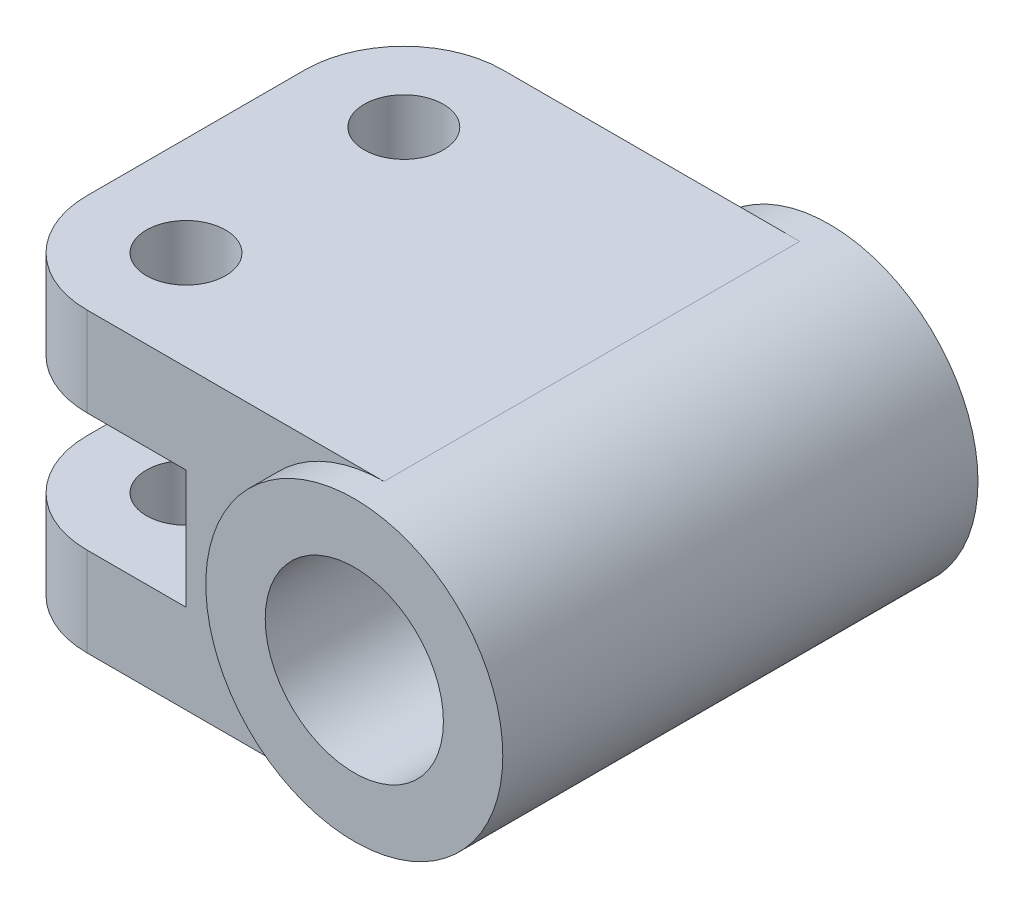
ISO-10303-21;
HEADER;
FILE_DESCRIPTION(('STEP AP214'),'2;1');
FILE_NAME('part.step','',(''),(''),'','','');
FILE_SCHEMA(('AUTOMOTIVE_DESIGN { 1 0 10303 214 1 1 1 1 }'));
ENDSEC;
DATA;
#1=APPLICATION_CONTEXT('core data for automotive mechanical design processes');
#2=APPLICATION_PROTOCOL_DEFINITION('international standard','automotive_design',2000,#1);
#3=PRODUCT_CONTEXT('',#1,'mechanical');
#4=PRODUCT('Part','Part','',(#3));
#5=PRODUCT_RELATED_PRODUCT_CATEGORY('part','',(#4));
#6=PRODUCT_DEFINITION_FORMATION('','',#4);
#7=PRODUCT_DEFINITION_CONTEXT('part definition',#1,'design');
#8=PRODUCT_DEFINITION('design','',#6,#7);
#9=PRODUCT_DEFINITION_SHAPE('','',#8);
#10=(LENGTH_UNIT() NAMED_UNIT(*) SI_UNIT(.MILLI.,.METRE.));
#11=(NAMED_UNIT(*) PLANE_ANGLE_UNIT() SI_UNIT($,.RADIAN.));
#12=(NAMED_UNIT(*) SI_UNIT($,.STERADIAN.) SOLID_ANGLE_UNIT());
#13=UNCERTAINTY_MEASURE_WITH_UNIT(LENGTH_MEASURE(1.E-05),#10,'distance_accuracy_value','');
#14=(GEOMETRIC_REPRESENTATION_CONTEXT(3) GLOBAL_UNCERTAINTY_ASSIGNED_CONTEXT((#13)) GLOBAL_UNIT_ASSIGNED_CONTEXT((#10,
#11,#12)) REPRESENTATION_CONTEXT('',''));
#15=CARTESIAN_POINT('',(0.,0.,0.));
#16=DIRECTION('',(0.,0.,1.));
#17=DIRECTION('',(1.,0.,0.));
#18=AXIS2_PLACEMENT_3D('',#15,#16,#17);
#19=CARTESIAN_POINT('',(40.,15.,42.));
#20=DIRECTION('',(0.,0.,-1.));
#21=DIRECTION('',(-1.,0.,0.));
#22=AXIS2_PLACEMENT_3D('',#19,#20,#21);
#23=CYLINDRICAL_SURFACE('',#22,15.);
#24=DIRECTION('',(0.,0.,-1.));
#25=VECTOR('',#24,1.);
#26=CARTESIAN_POINT('',(40.,0.,42.));
#27=LINE('',#26,#25);
#28=CARTESIAN_POINT('',(40.,0.,42.));
#29=VERTEX_POINT('',#28);
#30=CARTESIAN_POINT('',(40.,0.,0.));
#31=VERTEX_POINT('',#30);
#32=EDGE_CURVE('E137',#29,#31,#27,.T.);
#33=ORIENTED_EDGE('',*,*,#32,.T.);
#34=CARTESIAN_POINT('',(40.,15.,0.));
#35=DIRECTION('',(0.,0.,1.));
#36=DIRECTION('',(1.,0.,0.));
#37=AXIS2_PLACEMENT_3D('',#34,#35,#36);
#38=CIRCLE('',#37,15.);
#39=CARTESIAN_POINT('',(40.,30.,0.));
#40=VERTEX_POINT('',#39);
#41=EDGE_CURVE('E148',#40,#31,#38,.T.);
#42=ORIENTED_EDGE('',*,*,#41,.F.);
#43=DIRECTION('',(0.,0.,-1.));
#44=VECTOR('',#43,1.);
#45=CARTESIAN_POINT('',(40.,30.,42.));
#46=LINE('',#45,#44);
#47=CARTESIAN_POINT('',(40.,30.,42.));
#48=VERTEX_POINT('',#47);
#49=EDGE_CURVE('E157',#48,#40,#46,.T.);
#50=ORIENTED_EDGE('',*,*,#49,.F.);
#51=CARTESIAN_POINT('',(40.,15.,42.));
#52=DIRECTION('',(0.,0.,1.));
#53=DIRECTION('',(1.,0.,0.));
#54=AXIS2_PLACEMENT_3D('',#51,#52,#53);
#55=CIRCLE('',#54,15.);
#56=EDGE_CURVE('E161',#48,#29,#55,.T.);
#57=ORIENTED_EDGE('',*,*,#56,.T.);
#58=EDGE_LOOP('',(#33,#42,#50,#57));
#59=FACE_BOUND('',#58,.T.);
#60=CARTESIAN_POINT('',(40.,15.,-3.));
#61=DIRECTION('',(0.,0.,1.));
#62=DIRECTION('',(1.,0.,0.));
#63=AXIS2_PLACEMENT_3D('',#60,#61,#62);
#64=CIRCLE('',#63,15.);
#65=CARTESIAN_POINT('',(55.,15.,-3.));
#66=VERTEX_POINT('',#65);
#67=EDGE_CURVE('E307',#66,#66,#64,.T.);
#68=ORIENTED_EDGE('',*,*,#67,.T.);
#69=EDGE_LOOP('',(#68));
#70=FACE_BOUND('',#69,.T.);
#71=CARTESIAN_POINT('',(40.,15.,45.));
#72=DIRECTION('',(0.,0.,1.));
#73=DIRECTION('',(1.,0.,0.));
#74=AXIS2_PLACEMENT_3D('',#71,#72,#73);
#75=CIRCLE('',#74,15.);
#76=CARTESIAN_POINT('',(55.,15.,45.));
#77=VERTEX_POINT('',#76);
#78=EDGE_CURVE('E296',#77,#77,#75,.T.);
#79=ORIENTED_EDGE('',*,*,#78,.F.);
#80=EDGE_LOOP('',(#79));
#81=FACE_BOUND('',#80,.T.);
#82=ADVANCED_FACE('F43',(#59,#70,#81),#23,.T.);
#83=CARTESIAN_POINT('',(0.,30.,42.));
#84=DIRECTION('',(0.,1.,0.));
#85=DIRECTION('',(0.,0.,1.));
#86=AXIS2_PLACEMENT_3D('',#83,#84,#85);
#87=PLANE('',#86);
#88=CARTESIAN_POINT('',(10.,30.,32.));
#89=DIRECTION('',(0.,1.,0.));
#90=DIRECTION('',(0.,0.,1.));
#91=AXIS2_PLACEMENT_3D('',#88,#89,#90);
#92=CIRCLE('',#91,4.);
#93=CARTESIAN_POINT('',(10.,30.,36.));
#94=VERTEX_POINT('',#93);
#95=EDGE_CURVE('E321',#94,#94,#92,.T.);
#96=ORIENTED_EDGE('',*,*,#95,.F.);
#97=EDGE_LOOP('',(#96));
#98=FACE_BOUND('',#97,.T.);
#99=CARTESIAN_POINT('',(10.,30.,10.));
#100=DIRECTION('',(0.,1.,0.));
#101=DIRECTION('',(0.,0.,1.));
#102=AXIS2_PLACEMENT_3D('',#99,#100,#101);
#103=CIRCLE('',#102,4.);
#104=CARTESIAN_POINT('',(10.,30.,14.));
#105=VERTEX_POINT('',#104);
#106=EDGE_CURVE('E297',#105,#105,#103,.T.);
#107=ORIENTED_EDGE('',*,*,#106,.F.);
#108=EDGE_LOOP('',(#107));
#109=FACE_BOUND('',#108,.T.);
#110=DIRECTION('',(1.,0.,0.));
#111=VECTOR('',#110,1.);
#112=CARTESIAN_POINT('',(0.,30.,0.));
#113=LINE('',#112,#111);
#114=CARTESIAN_POINT('',(10.,30.,0.));
#115=VERTEX_POINT('',#114);
#116=EDGE_CURVE('E152',#115,#40,#113,.T.);
#117=ORIENTED_EDGE('',*,*,#116,.F.);
#118=CARTESIAN_POINT('',(10.,30.,10.));
#119=DIRECTION('',(0.,1.,0.));
#120=DIRECTION('',(0.,0.,1.));
#121=AXIS2_PLACEMENT_3D('',#118,#119,#120);
#122=CIRCLE('',#121,10.);
#123=CARTESIAN_POINT('',(0.,30.,10.));
#124=VERTEX_POINT('',#123);
#125=EDGE_CURVE('E199',#115,#124,#122,.T.);
#126=ORIENTED_EDGE('',*,*,#125,.T.);
#127=DIRECTION('',(0.,0.,-1.));
#128=VECTOR('',#127,1.);
#129=CARTESIAN_POINT('',(0.,30.,42.));
#130=LINE('',#129,#128);
#131=CARTESIAN_POINT('',(0.,30.,32.));
#132=VERTEX_POINT('',#131);
#133=EDGE_CURVE('E181',#132,#124,#130,.T.);
#134=ORIENTED_EDGE('',*,*,#133,.F.);
#135=CARTESIAN_POINT('',(10.,30.,32.));
#136=DIRECTION('',(0.,1.,0.));
#137=DIRECTION('',(0.,0.,1.));
#138=AXIS2_PLACEMENT_3D('',#135,#136,#137);
#139=CIRCLE('',#138,10.);
#140=CARTESIAN_POINT('',(10.,30.,42.));
#141=VERTEX_POINT('',#140);
#142=EDGE_CURVE('E197',#132,#141,#139,.T.);
#143=ORIENTED_EDGE('',*,*,#142,.T.);
#144=DIRECTION('',(1.,0.,0.));
#145=VECTOR('',#144,1.);
#146=CARTESIAN_POINT('',(0.,30.,42.));
#147=LINE('',#146,#145);
#148=EDGE_CURVE('E144',#141,#48,#147,.T.);
#149=ORIENTED_EDGE('',*,*,#148,.T.);
#150=ORIENTED_EDGE('',*,*,#49,.T.);
#151=EDGE_LOOP('',(#117,#126,#134,#143,#149,#150));
#152=FACE_BOUND('',#151,.T.);
#153=ADVANCED_FACE('F263',(#98,#109,#152),#87,.T.);
#154=CARTESIAN_POINT('',(0.,0.,42.));
#155=DIRECTION('',(1.,0.,0.));
#156=DIRECTION('',(0.,0.,-1.));
#157=AXIS2_PLACEMENT_3D('',#154,#155,#156);
#158=PLANE('',#157);
#159=ORIENTED_EDGE('',*,*,#133,.T.);
#160=DIRECTION('',(0.,-1.,0.));
#161=VECTOR('',#160,1.);
#162=CARTESIAN_POINT('',(0.,0.,10.));
#163=LINE('',#162,#161);
#164=CARTESIAN_POINT('',(0.,21.,10.));
#165=VERTEX_POINT('',#164);
#166=EDGE_CURVE('E186',#124,#165,#163,.T.);
#167=ORIENTED_EDGE('',*,*,#166,.T.);
#168=DIRECTION('',(0.,0.,-1.));
#169=VECTOR('',#168,1.);
#170=CARTESIAN_POINT('',(0.,21.,42.));
#171=LINE('',#170,#169);
#172=CARTESIAN_POINT('',(0.,21.,32.));
#173=VERTEX_POINT('',#172);
#174=EDGE_CURVE('E178',#173,#165,#171,.T.);
#175=ORIENTED_EDGE('',*,*,#174,.F.);
#176=DIRECTION('',(0.,-1.,0.));
#177=VECTOR('',#176,1.);
#178=CARTESIAN_POINT('',(0.,30.,32.));
#179=LINE('',#178,#177);
#180=EDGE_CURVE('E156',#173,#132,#179,.F.);
#181=ORIENTED_EDGE('',*,*,#180,.T.);
#182=EDGE_LOOP('',(#159,#167,#175,#181));
#183=FACE_BOUND('',#182,.T.);
#184=ADVANCED_FACE('F270',(#183),#158,.F.);
#185=CARTESIAN_POINT('',(0.,21.,42.));
#186=DIRECTION('',(0.,1.,0.));
#187=DIRECTION('',(0.,0.,1.));
#188=AXIS2_PLACEMENT_3D('',#185,#186,#187);
#189=PLANE('',#188);
#190=CARTESIAN_POINT('',(10.,21.,32.));
#191=DIRECTION('',(0.,1.,0.));
#192=DIRECTION('',(0.,0.,1.));
#193=AXIS2_PLACEMENT_3D('',#190,#191,#192);
#194=CIRCLE('',#193,4.);
#195=CARTESIAN_POINT('',(10.,21.,36.));
#196=VERTEX_POINT('',#195);
#197=EDGE_CURVE('E324',#196,#196,#194,.T.);
#198=ORIENTED_EDGE('',*,*,#197,.T.);
#199=EDGE_LOOP('',(#198));
#200=FACE_BOUND('',#199,.T.);
#201=CARTESIAN_POINT('',(10.,21.,10.));
#202=DIRECTION('',(0.,1.,0.));
#203=DIRECTION('',(0.,0.,1.));
#204=AXIS2_PLACEMENT_3D('',#201,#202,#203);
#205=CIRCLE('',#204,4.);
#206=CARTESIAN_POINT('',(10.,21.,14.));
#207=VERTEX_POINT('',#206);
#208=EDGE_CURVE('E302',#207,#207,#205,.T.);
#209=ORIENTED_EDGE('',*,*,#208,.T.);
#210=EDGE_LOOP('',(#209));
#211=FACE_BOUND('',#210,.T.);
#212=ORIENTED_EDGE('',*,*,#174,.T.);
#213=CARTESIAN_POINT('',(10.,21.,10.));
#214=DIRECTION('',(0.,1.,0.));
#215=DIRECTION('',(0.,0.,1.));
#216=AXIS2_PLACEMENT_3D('',#213,#214,#215);
#217=CIRCLE('',#216,10.);
#218=CARTESIAN_POINT('',(10.,21.,0.));
#219=VERTEX_POINT('',#218);
#220=EDGE_CURVE('E191',#165,#219,#217,.F.);
#221=ORIENTED_EDGE('',*,*,#220,.T.);
#222=DIRECTION('',(1.,0.,0.));
#223=VECTOR('',#222,1.);
#224=CARTESIAN_POINT('',(0.,21.,0.));
#225=LINE('',#224,#223);
#226=CARTESIAN_POINT('',(20.,21.,0.));
#227=VERTEX_POINT('',#226);
#228=EDGE_CURVE('E233',#219,#227,#225,.T.);
#229=ORIENTED_EDGE('',*,*,#228,.T.);
#230=DIRECTION('',(0.,0.,-1.));
#231=VECTOR('',#230,1.);
#232=CARTESIAN_POINT('',(20.,21.,42.));
#233=LINE('',#232,#231);
#234=CARTESIAN_POINT('',(20.,21.,42.));
#235=VERTEX_POINT('',#234);
#236=EDGE_CURVE('E175',#235,#227,#233,.T.);
#237=ORIENTED_EDGE('',*,*,#236,.F.);
#238=DIRECTION('',(1.,0.,0.));
#239=VECTOR('',#238,1.);
#240=CARTESIAN_POINT('',(0.,21.,42.));
#241=LINE('',#240,#239);
#242=CARTESIAN_POINT('',(10.,21.,42.));
#243=VERTEX_POINT('',#242);
#244=EDGE_CURVE('E217',#243,#235,#241,.T.);
#245=ORIENTED_EDGE('',*,*,#244,.F.);
#246=CARTESIAN_POINT('',(10.,21.,32.));
#247=DIRECTION('',(0.,1.,0.));
#248=DIRECTION('',(0.,0.,1.));
#249=AXIS2_PLACEMENT_3D('',#246,#247,#248);
#250=CIRCLE('',#249,10.);
#251=EDGE_CURVE('E189',#243,#173,#250,.F.);
#252=ORIENTED_EDGE('',*,*,#251,.T.);
#253=EDGE_LOOP('',(#212,#221,#229,#237,#245,#252));
#254=FACE_BOUND('',#253,.T.);
#255=ADVANCED_FACE('F222',(#200,#211,#254),#189,.F.);
#256=CARTESIAN_POINT('',(20.,0.,42.));
#257=DIRECTION('',(-1.,0.,0.));
#258=DIRECTION('',(0.,0.,1.));
#259=AXIS2_PLACEMENT_3D('',#256,#257,#258);
#260=PLANE('',#259);
#261=DIRECTION('',(0.,1.,0.));
#262=VECTOR('',#261,1.);
#263=CARTESIAN_POINT('',(20.,0.,0.));
#264=LINE('',#263,#262);
#265=CARTESIAN_POINT('',(20.,9.,0.));
#266=VERTEX_POINT('',#265);
#267=EDGE_CURVE('E235',#266,#227,#264,.T.);
#268=ORIENTED_EDGE('',*,*,#267,.F.);
#269=DIRECTION('',(0.,0.,-1.));
#270=VECTOR('',#269,1.);
#271=CARTESIAN_POINT('',(20.,9.,42.));
#272=LINE('',#271,#270);
#273=CARTESIAN_POINT('',(20.,9.,42.));
#274=VERTEX_POINT('',#273);
#275=EDGE_CURVE('E172',#274,#266,#272,.T.);
#276=ORIENTED_EDGE('',*,*,#275,.F.);
#277=DIRECTION('',(0.,1.,0.));
#278=VECTOR('',#277,1.);
#279=CARTESIAN_POINT('',(20.,0.,42.));
#280=LINE('',#279,#278);
#281=EDGE_CURVE('E225',#274,#235,#280,.T.);
#282=ORIENTED_EDGE('',*,*,#281,.T.);
#283=ORIENTED_EDGE('',*,*,#236,.T.);
#284=EDGE_LOOP('',(#268,#276,#282,#283));
#285=FACE_BOUND('',#284,.T.);
#286=ADVANCED_FACE('F243',(#285),#260,.T.);
#287=CARTESIAN_POINT('',(0.,9.,42.));
#288=DIRECTION('',(0.,1.,0.));
#289=DIRECTION('',(0.,0.,1.));
#290=AXIS2_PLACEMENT_3D('',#287,#288,#289);
#291=PLANE('',#290);
#292=CARTESIAN_POINT('',(10.,9.,32.));
#293=DIRECTION('',(0.,1.,0.));
#294=DIRECTION('',(0.,0.,1.));
#295=AXIS2_PLACEMENT_3D('',#292,#293,#294);
#296=CIRCLE('',#295,4.);
#297=CARTESIAN_POINT('',(10.,9.,36.));
#298=VERTEX_POINT('',#297);
#299=EDGE_CURVE('E327',#298,#298,#296,.T.);
#300=ORIENTED_EDGE('',*,*,#299,.F.);
#301=EDGE_LOOP('',(#300));
#302=FACE_BOUND('',#301,.T.);
#303=CARTESIAN_POINT('',(10.,9.,10.));
#304=DIRECTION('',(0.,1.,0.));
#305=DIRECTION('',(0.,0.,1.));
#306=AXIS2_PLACEMENT_3D('',#303,#304,#305);
#307=CIRCLE('',#306,4.);
#308=CARTESIAN_POINT('',(10.,9.,14.));
#309=VERTEX_POINT('',#308);
#310=EDGE_CURVE('E315',#309,#309,#307,.T.);
#311=ORIENTED_EDGE('',*,*,#310,.F.);
#312=EDGE_LOOP('',(#311));
#313=FACE_BOUND('',#312,.T.);
#314=DIRECTION('',(1.,0.,0.));
#315=VECTOR('',#314,1.);
#316=CARTESIAN_POINT('',(0.,9.,0.));
#317=LINE('',#316,#315);
#318=CARTESIAN_POINT('',(10.,9.,0.));
#319=VERTEX_POINT('',#318);
#320=EDGE_CURVE('E145',#319,#266,#317,.T.);
#321=ORIENTED_EDGE('',*,*,#320,.F.);
#322=CARTESIAN_POINT('',(10.,9.,10.));
#323=DIRECTION('',(0.,1.,0.));
#324=DIRECTION('',(0.,0.,1.));
#325=AXIS2_PLACEMENT_3D('',#322,#323,#324);
#326=CIRCLE('',#325,10.);
#327=CARTESIAN_POINT('',(0.,9.,10.));
#328=VERTEX_POINT('',#327);
#329=EDGE_CURVE('E203',#319,#328,#326,.T.);
#330=ORIENTED_EDGE('',*,*,#329,.T.);
#331=DIRECTION('',(0.,0.,-1.));
#332=VECTOR('',#331,1.);
#333=CARTESIAN_POINT('',(0.,9.,42.));
#334=LINE('',#333,#332);
#335=CARTESIAN_POINT('',(0.,9.,32.));
#336=VERTEX_POINT('',#335);
#337=EDGE_CURVE('E165',#336,#328,#334,.T.);
#338=ORIENTED_EDGE('',*,*,#337,.F.);
#339=CARTESIAN_POINT('',(10.,9.,32.));
#340=DIRECTION('',(0.,1.,0.));
#341=DIRECTION('',(0.,0.,1.));
#342=AXIS2_PLACEMENT_3D('',#339,#340,#341);
#343=CIRCLE('',#342,10.);
#344=CARTESIAN_POINT('',(10.,9.,42.));
#345=VERTEX_POINT('',#344);
#346=EDGE_CURVE('E201',#336,#345,#343,.T.);
#347=ORIENTED_EDGE('',*,*,#346,.T.);
#348=DIRECTION('',(1.,0.,0.));
#349=VECTOR('',#348,1.);
#350=CARTESIAN_POINT('',(0.,9.,42.));
#351=LINE('',#350,#349);
#352=EDGE_CURVE('E167',#345,#274,#351,.T.);
#353=ORIENTED_EDGE('',*,*,#352,.T.);
#354=ORIENTED_EDGE('',*,*,#275,.T.);
#355=EDGE_LOOP('',(#321,#330,#338,#347,#353,#354));
#356=FACE_BOUND('',#355,.T.);
#357=ADVANCED_FACE('F241',(#302,#313,#356),#291,.T.);
#358=CARTESIAN_POINT('',(0.,0.,42.));
#359=DIRECTION('',(-1.,0.,0.));
#360=DIRECTION('',(0.,0.,1.));
#361=AXIS2_PLACEMENT_3D('',#358,#359,#360);
#362=PLANE('',#361);
#363=ORIENTED_EDGE('',*,*,#337,.T.);
#364=DIRECTION('',(0.,1.,0.));
#365=VECTOR('',#364,1.);
#366=CARTESIAN_POINT('',(0.,0.,10.));
#367=LINE('',#366,#365);
#368=CARTESIAN_POINT('',(0.,0.,10.));
#369=VERTEX_POINT('',#368);
#370=EDGE_CURVE('E64',#328,#369,#367,.F.);
#371=ORIENTED_EDGE('',*,*,#370,.T.);
#372=DIRECTION('',(0.,0.,-1.));
#373=VECTOR('',#372,1.);
#374=CARTESIAN_POINT('',(0.,0.,42.));
#375=LINE('',#374,#373);
#376=CARTESIAN_POINT('',(0.,0.,32.));
#377=VERTEX_POINT('',#376);
#378=EDGE_CURVE('E162',#377,#369,#375,.T.);
#379=ORIENTED_EDGE('',*,*,#378,.F.);
#380=DIRECTION('',(0.,1.,0.));
#381=VECTOR('',#380,1.);
#382=CARTESIAN_POINT('',(0.,0.,32.));
#383=LINE('',#382,#381);
#384=EDGE_CURVE('E205',#377,#336,#383,.T.);
#385=ORIENTED_EDGE('',*,*,#384,.T.);
#386=EDGE_LOOP('',(#363,#371,#379,#385));
#387=FACE_BOUND('',#386,.T.);
#388=ADVANCED_FACE('F248',(#387),#362,.T.);
#389=CARTESIAN_POINT('',(0.,0.,42.));
#390=DIRECTION('',(0.,1.,0.));
#391=DIRECTION('',(0.,0.,1.));
#392=AXIS2_PLACEMENT_3D('',#389,#390,#391);
#393=PLANE('',#392);
#394=CARTESIAN_POINT('',(10.,0.,32.));
#395=DIRECTION('',(0.,1.,0.));
#396=DIRECTION('',(0.,0.,1.));
#397=AXIS2_PLACEMENT_3D('',#394,#395,#396);
#398=CIRCLE('',#397,4.);
#399=CARTESIAN_POINT('',(10.,0.,36.));
#400=VERTEX_POINT('',#399);
#401=EDGE_CURVE('E330',#400,#400,#398,.T.);
#402=ORIENTED_EDGE('',*,*,#401,.T.);
#403=EDGE_LOOP('',(#402));
#404=FACE_BOUND('',#403,.T.);
#405=CARTESIAN_POINT('',(10.,0.,10.));
#406=DIRECTION('',(0.,1.,0.));
#407=DIRECTION('',(0.,0.,1.));
#408=AXIS2_PLACEMENT_3D('',#405,#406,#407);
#409=CIRCLE('',#408,4.);
#410=CARTESIAN_POINT('',(10.,0.,14.));
#411=VERTEX_POINT('',#410);
#412=EDGE_CURVE('E318',#411,#411,#409,.T.);
#413=ORIENTED_EDGE('',*,*,#412,.T.);
#414=EDGE_LOOP('',(#413));
#415=FACE_BOUND('',#414,.T.);
#416=ORIENTED_EDGE('',*,*,#378,.T.);
#417=CARTESIAN_POINT('',(10.,0.,10.));
#418=DIRECTION('',(0.,1.,0.));
#419=DIRECTION('',(0.,0.,1.));
#420=AXIS2_PLACEMENT_3D('',#417,#418,#419);
#421=CIRCLE('',#420,10.);
#422=CARTESIAN_POINT('',(10.,0.,0.));
#423=VERTEX_POINT('',#422);
#424=EDGE_CURVE('E140',#369,#423,#421,.F.);
#425=ORIENTED_EDGE('',*,*,#424,.T.);
#426=DIRECTION('',(1.,0.,0.));
#427=VECTOR('',#426,1.);
#428=CARTESIAN_POINT('',(0.,0.,0.));
#429=LINE('',#428,#427);
#430=EDGE_CURVE('E133',#423,#31,#429,.T.);
#431=ORIENTED_EDGE('',*,*,#430,.T.);
#432=ORIENTED_EDGE('',*,*,#32,.F.);
#433=DIRECTION('',(1.,0.,0.));
#434=VECTOR('',#433,1.);
#435=CARTESIAN_POINT('',(0.,0.,42.));
#436=LINE('',#435,#434);
#437=CARTESIAN_POINT('',(10.,0.,42.));
#438=VERTEX_POINT('',#437);
#439=EDGE_CURVE('E163',#438,#29,#436,.T.);
#440=ORIENTED_EDGE('',*,*,#439,.F.);
#441=CARTESIAN_POINT('',(10.,0.,32.));
#442=DIRECTION('',(0.,1.,0.));
#443=DIRECTION('',(0.,0.,1.));
#444=AXIS2_PLACEMENT_3D('',#441,#442,#443);
#445=CIRCLE('',#444,10.);
#446=EDGE_CURVE('E209',#438,#377,#445,.F.);
#447=ORIENTED_EDGE('',*,*,#446,.T.);
#448=EDGE_LOOP('',(#416,#425,#431,#432,#440,#447));
#449=FACE_BOUND('',#448,.T.);
#450=ADVANCED_FACE('F135',(#404,#415,#449),#393,.F.);
#451=CARTESIAN_POINT('',(0.,0.,42.));
#452=DIRECTION('',(0.,0.,1.));
#453=DIRECTION('',(1.,0.,0.));
#454=AXIS2_PLACEMENT_3D('',#451,#452,#453);
#455=PLANE('',#454);
#456=ORIENTED_EDGE('',*,*,#352,.F.);
#457=DIRECTION('',(0.,1.,0.));
#458=VECTOR('',#457,1.);
#459=CARTESIAN_POINT('',(10.,0.,42.));
#460=LINE('',#459,#458);
#461=EDGE_CURVE('E11',#345,#438,#460,.F.);
#462=ORIENTED_EDGE('',*,*,#461,.T.);
#463=ORIENTED_EDGE('',*,*,#439,.T.);
#464=ORIENTED_EDGE('',*,*,#56,.F.);
#465=ORIENTED_EDGE('',*,*,#148,.F.);
#466=DIRECTION('',(0.,-1.,0.));
#467=VECTOR('',#466,1.);
#468=CARTESIAN_POINT('',(10.,21.,42.));
#469=LINE('',#468,#467);
#470=EDGE_CURVE('E51',#141,#243,#469,.T.);
#471=ORIENTED_EDGE('',*,*,#470,.T.);
#472=ORIENTED_EDGE('',*,*,#244,.T.);
#473=ORIENTED_EDGE('',*,*,#281,.F.);
#474=EDGE_LOOP('',(#456,#462,#463,#464,#465,#471,#472,#473));
#475=FACE_BOUND('',#474,.T.);
#476=ADVANCED_FACE('F215',(#475),#455,.T.);
#477=CARTESIAN_POINT('',(0.,0.,0.));
#478=DIRECTION('',(0.,0.,1.));
#479=DIRECTION('',(1.,0.,0.));
#480=AXIS2_PLACEMENT_3D('',#477,#478,#479);
#481=PLANE('',#480);
#482=ORIENTED_EDGE('',*,*,#228,.F.);
#483=DIRECTION('',(0.,-1.,0.));
#484=VECTOR('',#483,1.);
#485=CARTESIAN_POINT('',(10.,0.,0.));
#486=LINE('',#485,#484);
#487=EDGE_CURVE('E195',#219,#115,#486,.F.);
#488=ORIENTED_EDGE('',*,*,#487,.T.);
#489=ORIENTED_EDGE('',*,*,#116,.T.);
#490=ORIENTED_EDGE('',*,*,#41,.T.);
#491=ORIENTED_EDGE('',*,*,#430,.F.);
#492=DIRECTION('',(0.,1.,0.));
#493=VECTOR('',#492,1.);
#494=CARTESIAN_POINT('',(10.,9.,0.));
#495=LINE('',#494,#493);
#496=EDGE_CURVE('E193',#423,#319,#495,.T.);
#497=ORIENTED_EDGE('',*,*,#496,.T.);
#498=ORIENTED_EDGE('',*,*,#320,.T.);
#499=ORIENTED_EDGE('',*,*,#267,.T.);
#500=EDGE_LOOP('',(#482,#488,#489,#490,#491,#497,#498,#499));
#501=FACE_BOUND('',#500,.T.);
#502=ADVANCED_FACE('F150',(#501),#481,.F.);
#503=CARTESIAN_POINT('',(40.,15.,-3.));
#504=DIRECTION('',(0.,0.,1.));
#505=DIRECTION('',(1.,0.,0.));
#506=AXIS2_PLACEMENT_3D('',#503,#504,#505);
#507=PLANE('',#506);
#508=CARTESIAN_POINT('',(40.,15.,-3.));
#509=DIRECTION('',(0.,0.,1.));
#510=DIRECTION('',(1.,0.,0.));
#511=AXIS2_PLACEMENT_3D('',#508,#509,#510);
#512=CIRCLE('',#511,9.);
#513=CARTESIAN_POINT('',(31.,15.,-3.));
#514=VERTEX_POINT('',#513);
#515=EDGE_CURVE('E291',#514,#514,#512,.T.);
#516=ORIENTED_EDGE('',*,*,#515,.T.);
#517=EDGE_LOOP('',(#516));
#518=FACE_BOUND('',#517,.T.);
#519=ORIENTED_EDGE('',*,*,#67,.F.);
#520=EDGE_LOOP('',(#519));
#521=FACE_BOUND('',#520,.T.);
#522=ADVANCED_FACE('F278',(#518,#521),#507,.F.);
#523=CARTESIAN_POINT('',(40.,15.,42.));
#524=DIRECTION('',(0.,0.,-1.));
#525=DIRECTION('',(-1.,0.,0.));
#526=AXIS2_PLACEMENT_3D('',#523,#524,#525);
#527=CYLINDRICAL_SURFACE('',#526,9.);
#528=CARTESIAN_POINT('',(40.,15.,45.));
#529=DIRECTION('',(0.,0.,1.));
#530=DIRECTION('',(1.,0.,0.));
#531=AXIS2_PLACEMENT_3D('',#528,#529,#530);
#532=CIRCLE('',#531,9.);
#533=CARTESIAN_POINT('',(31.,15.,45.));
#534=VERTEX_POINT('',#533);
#535=EDGE_CURVE('E294',#534,#534,#532,.T.);
#536=CARTESIAN_POINT('',(31.,15.,-3.));
#537=CARTESIAN_POINT('',(31.,15.,-2.5));
#538=CARTESIAN_POINT('',(31.,15.,-2.));
#539=CARTESIAN_POINT('',(31.,15.,-1.));
#540=CARTESIAN_POINT('',(31.,15.,-0.5));
#541=CARTESIAN_POINT('',(31.,15.,0.5));
#542=CARTESIAN_POINT('',(31.,15.,1.));
#543=CARTESIAN_POINT('',(31.,15.,2.));
#544=CARTESIAN_POINT('',(31.,15.,2.5));
#545=CARTESIAN_POINT('',(31.,15.,3.5));
#546=CARTESIAN_POINT('',(31.,15.,4.));
#547=CARTESIAN_POINT('',(31.,15.,5.));
#548=CARTESIAN_POINT('',(31.,15.,5.5));
#549=CARTESIAN_POINT('',(31.,15.,6.5));
#550=CARTESIAN_POINT('',(31.,15.,7.));
#551=CARTESIAN_POINT('',(31.,15.,8.));
#552=CARTESIAN_POINT('',(31.,15.,8.5));
#553=CARTESIAN_POINT('',(31.,15.,9.5));
#554=CARTESIAN_POINT('',(31.,15.,10.));
#555=CARTESIAN_POINT('',(31.,15.,11.));
#556=CARTESIAN_POINT('',(31.,15.,11.5));
#557=CARTESIAN_POINT('',(31.,15.,12.5));
#558=CARTESIAN_POINT('',(31.,15.,13.));
#559=CARTESIAN_POINT('',(31.,15.,14.));
#560=CARTESIAN_POINT('',(31.,15.,14.5));
#561=CARTESIAN_POINT('',(31.,15.,15.5));
#562=CARTESIAN_POINT('',(31.,15.,16.));
#563=CARTESIAN_POINT('',(31.,15.,17.));
#564=CARTESIAN_POINT('',(31.,15.,17.5));
#565=CARTESIAN_POINT('',(31.,15.,18.5));
#566=CARTESIAN_POINT('',(31.,15.,19.));
#567=CARTESIAN_POINT('',(31.,15.,20.));
#568=CARTESIAN_POINT('',(31.,15.,20.5));
#569=CARTESIAN_POINT('',(31.,15.,21.5));
#570=CARTESIAN_POINT('',(31.,15.,22.));
#571=CARTESIAN_POINT('',(31.,15.,23.));
#572=CARTESIAN_POINT('',(31.,15.,23.5));
#573=CARTESIAN_POINT('',(31.,15.,24.5));
#574=CARTESIAN_POINT('',(31.,15.,25.));
#575=CARTESIAN_POINT('',(31.,15.,26.));
#576=CARTESIAN_POINT('',(31.,15.,26.5));
#577=CARTESIAN_POINT('',(31.,15.,27.5));
#578=CARTESIAN_POINT('',(31.,15.,28.));
#579=CARTESIAN_POINT('',(31.,15.,29.));
#580=CARTESIAN_POINT('',(31.,15.,29.5));
#581=CARTESIAN_POINT('',(31.,15.,30.5));
#582=CARTESIAN_POINT('',(31.,15.,31.));
#583=CARTESIAN_POINT('',(31.,15.,32.));
#584=CARTESIAN_POINT('',(31.,15.,32.5));
#585=CARTESIAN_POINT('',(31.,15.,33.5));
#586=CARTESIAN_POINT('',(31.,15.,34.));
#587=CARTESIAN_POINT('',(31.,15.,35.));
#588=CARTESIAN_POINT('',(31.,15.,35.5));
#589=CARTESIAN_POINT('',(31.,15.,36.5));
#590=CARTESIAN_POINT('',(31.,15.,37.));
#591=CARTESIAN_POINT('',(31.,15.,38.));
#592=CARTESIAN_POINT('',(31.,15.,38.5));
#593=CARTESIAN_POINT('',(31.,15.,39.5));
#594=CARTESIAN_POINT('',(31.,15.,40.));
#595=CARTESIAN_POINT('',(31.,15.,41.));
#596=CARTESIAN_POINT('',(31.,15.,41.5));
#597=CARTESIAN_POINT('',(31.,15.,42.5));
#598=CARTESIAN_POINT('',(31.,15.,43.));
#599=CARTESIAN_POINT('',(31.,15.,44.));
#600=CARTESIAN_POINT('',(31.,15.,44.5));
#601=CARTESIAN_POINT('',(31.,15.,45.));
#602=B_SPLINE_CURVE_WITH_KNOTS('',3,(#536,#537,#538,#539,#540,#541,#542,#543,#544,#545,#546,
#547,#548,#549,#550,#551,#552,#553,#554,#555,#556,#557,#558,#559,#560,#561,#562,#563,#564,#565,
#566,#567,#568,#569,#570,#571,#572,#573,#574,#575,#576,#577,#578,#579,#580,#581,#582,#583,#584,
#585,#586,#587,#588,#589,#590,#591,#592,#593,#594,#595,#596,#597,#598,#599,#600,#601),
.UNSPECIFIED.,.F.,.F.,(4,2,2,2,2,2,2,2,2,2,2,2,2,2,2,2,2,2,2,2,2,2,2,2,2,2,2,2,2,2,2,2,4),(0.,
1.5,3.,4.5,6.00000000000001,7.5,9.,10.5,12.,13.5,15.,16.5,18.,19.5,21.,22.5,24.,25.5,27.,28.5,
30.,31.5,33.,34.5,36.,37.5,39.,40.5,42.,43.5,45.,46.5,48.),.UNSPECIFIED.);
#603=EDGE_CURVE('BSEAM275',#514,#534,#602,.T.);
#604=ORIENTED_EDGE('',*,*,#515,.F.);
#605=ORIENTED_EDGE('',*,*,#535,.T.);
#606=ORIENTED_EDGE('',*,*,#603,.T.);
#607=ORIENTED_EDGE('',*,*,#603,.F.);
#608=EDGE_LOOP('',(#604,#606,#605,#607));
#609=FACE_BOUND('',#608,.T.);
#610=ADVANCED_FACE('F275',(#609),#527,.F.);
#611=CARTESIAN_POINT('',(40.,15.,45.));
#612=DIRECTION('',(0.,0.,1.));
#613=DIRECTION('',(1.,0.,0.));
#614=AXIS2_PLACEMENT_3D('',#611,#612,#613);
#615=PLANE('',#614);
#616=ORIENTED_EDGE('',*,*,#78,.T.);
#617=EDGE_LOOP('',(#616));
#618=FACE_BOUND('',#617,.T.);
#619=ORIENTED_EDGE('',*,*,#535,.F.);
#620=EDGE_LOOP('',(#619));
#621=FACE_BOUND('',#620,.T.);
#622=ADVANCED_FACE('F277',(#618,#621),#615,.T.);
#623=CARTESIAN_POINT('',(10.,0.,10.));
#624=DIRECTION('',(0.,1.,0.));
#625=DIRECTION('',(0.,0.,1.));
#626=AXIS2_PLACEMENT_3D('',#623,#624,#625);
#627=CYLINDRICAL_SURFACE('',#626,4.);
#628=ORIENTED_EDGE('',*,*,#310,.T.);
#629=EDGE_LOOP('',(#628));
#630=FACE_BOUND('',#629,.T.);
#631=ORIENTED_EDGE('',*,*,#412,.F.);
#632=EDGE_LOOP('',(#631));
#633=FACE_BOUND('',#632,.T.);
#634=ADVANCED_FACE('F283',(#630,#633),#627,.F.);
#635=CARTESIAN_POINT('',(10.,30.,14.));
#636=CARTESIAN_POINT('',(10.,29.90625,14.));
#637=CARTESIAN_POINT('',(10.,29.8125,14.));
#638=CARTESIAN_POINT('',(10.,29.625,14.));
#639=CARTESIAN_POINT('',(10.,29.53125,14.));
#640=CARTESIAN_POINT('',(10.,29.34375,14.));
#641=CARTESIAN_POINT('',(10.,29.25,14.));
#642=CARTESIAN_POINT('',(10.,29.0625,14.));
#643=CARTESIAN_POINT('',(10.,28.96875,14.));
#644=CARTESIAN_POINT('',(10.,28.78125,14.));
#645=CARTESIAN_POINT('',(10.,28.6875,14.));
#646=CARTESIAN_POINT('',(10.,28.5,14.));
#647=CARTESIAN_POINT('',(10.,28.40625,14.));
#648=CARTESIAN_POINT('',(10.,28.21875,14.));
#649=CARTESIAN_POINT('',(10.,28.125,14.));
#650=CARTESIAN_POINT('',(10.,27.9375,14.));
#651=CARTESIAN_POINT('',(10.,27.84375,14.));
#652=CARTESIAN_POINT('',(10.,27.65625,14.));
#653=CARTESIAN_POINT('',(10.,27.5625,14.));
#654=CARTESIAN_POINT('',(10.,27.375,14.));
#655=CARTESIAN_POINT('',(10.,27.28125,14.));
#656=CARTESIAN_POINT('',(10.,27.09375,14.));
#657=CARTESIAN_POINT('',(10.,27.,14.));
#658=CARTESIAN_POINT('',(10.,26.8125,14.));
#659=CARTESIAN_POINT('',(10.,26.71875,14.));
#660=CARTESIAN_POINT('',(10.,26.53125,14.));
#661=CARTESIAN_POINT('',(10.,26.4375,14.));
#662=CARTESIAN_POINT('',(10.,26.25,14.));
#663=CARTESIAN_POINT('',(10.,26.15625,14.));
#664=CARTESIAN_POINT('',(10.,25.96875,14.));
#665=CARTESIAN_POINT('',(10.,25.875,14.));
#666=CARTESIAN_POINT('',(10.,25.6875,14.));
#667=CARTESIAN_POINT('',(10.,25.59375,14.));
#668=CARTESIAN_POINT('',(10.,25.40625,14.));
#669=CARTESIAN_POINT('',(10.,25.3125,14.));
#670=CARTESIAN_POINT('',(10.,25.125,14.));
#671=CARTESIAN_POINT('',(10.,25.03125,14.));
#672=CARTESIAN_POINT('',(10.,24.84375,14.));
#673=CARTESIAN_POINT('',(10.,24.75,14.));
#674=CARTESIAN_POINT('',(10.,24.5625,14.));
#675=CARTESIAN_POINT('',(10.,24.46875,14.));
#676=CARTESIAN_POINT('',(10.,24.28125,14.));
#677=CARTESIAN_POINT('',(10.,24.1875,14.));
#678=CARTESIAN_POINT('',(10.,24.,14.));
#679=CARTESIAN_POINT('',(10.,23.90625,14.));
#680=CARTESIAN_POINT('',(10.,23.71875,14.));
#681=CARTESIAN_POINT('',(10.,23.625,14.));
#682=CARTESIAN_POINT('',(10.,23.4375,14.));
#683=CARTESIAN_POINT('',(10.,23.34375,14.));
#684=CARTESIAN_POINT('',(10.,23.15625,14.));
#685=CARTESIAN_POINT('',(10.,23.0625,14.));
#686=CARTESIAN_POINT('',(10.,22.875,14.));
#687=CARTESIAN_POINT('',(10.,22.78125,14.));
#688=CARTESIAN_POINT('',(10.,22.59375,14.));
#689=CARTESIAN_POINT('',(10.,22.5,14.));
#690=CARTESIAN_POINT('',(10.,22.3125,14.));
#691=CARTESIAN_POINT('',(10.,22.21875,14.));
#692=CARTESIAN_POINT('',(10.,22.03125,14.));
#693=CARTESIAN_POINT('',(10.,21.9375,14.));
#694=CARTESIAN_POINT('',(10.,21.75,14.));
#695=CARTESIAN_POINT('',(10.,21.65625,14.));
#696=CARTESIAN_POINT('',(10.,21.46875,14.));
#697=CARTESIAN_POINT('',(10.,21.375,14.));
#698=CARTESIAN_POINT('',(10.,21.1875,14.));
#699=CARTESIAN_POINT('',(10.,21.09375,14.));
#700=CARTESIAN_POINT('',(10.,21.,14.));
#701=B_SPLINE_CURVE_WITH_KNOTS('',3,(#635,#636,#637,#638,#639,#640,#641,#642,#643,#644,#645,
#646,#647,#648,#649,#650,#651,#652,#653,#654,#655,#656,#657,#658,#659,#660,#661,#662,#663,#664,
#665,#666,#667,#668,#669,#670,#671,#672,#673,#674,#675,#676,#677,#678,#679,#680,#681,#682,#683,
#684,#685,#686,#687,#688,#689,#690,#691,#692,#693,#694,#695,#696,#697,#698,#699,#700),
.UNSPECIFIED.,.F.,.F.,(4,2,2,2,2,2,2,2,2,2,2,2,2,2,2,2,2,2,2,2,2,2,2,2,2,2,2,2,2,2,2,2,4),(0.,
0.28125,0.5625,0.843750000000001,1.125,1.40625,1.6875,1.96875,2.25,2.53125,2.8125,3.09375,3.375,
3.65625,3.9375,4.21875,4.5,4.78125,5.0625,5.34375,5.625,5.90625,6.1875,6.46875,6.75,7.03125,
7.3125,7.59375,7.875,8.15625,8.4375,8.71875,9.),.UNSPECIFIED.);
#702=EDGE_CURVE('BSEAM338',#105,#207,#701,.T.);
#703=ORIENTED_EDGE('',*,*,#106,.T.);
#704=ORIENTED_EDGE('',*,*,#208,.F.);
#705=ORIENTED_EDGE('',*,*,#702,.T.);
#706=ORIENTED_EDGE('',*,*,#702,.F.);
#707=EDGE_LOOP('',(#703,#705,#704,#706));
#708=FACE_BOUND('',#707,.T.);
#709=ADVANCED_FACE('F338',(#708),#627,.F.);
#710=CARTESIAN_POINT('',(10.,0.,32.));
#711=DIRECTION('',(0.,1.,0.));
#712=DIRECTION('',(0.,0.,1.));
#713=AXIS2_PLACEMENT_3D('',#710,#711,#712);
#714=CYLINDRICAL_SURFACE('',#713,4.);
#715=ORIENTED_EDGE('',*,*,#299,.T.);
#716=EDGE_LOOP('',(#715));
#717=FACE_BOUND('',#716,.T.);
#718=ORIENTED_EDGE('',*,*,#401,.F.);
#719=EDGE_LOOP('',(#718));
#720=FACE_BOUND('',#719,.T.);
#721=ADVANCED_FACE('F336',(#717,#720),#714,.F.);
#722=CARTESIAN_POINT('',(10.,30.,36.));
#723=CARTESIAN_POINT('',(10.,29.90625,36.));
#724=CARTESIAN_POINT('',(10.,29.8125,36.));
#725=CARTESIAN_POINT('',(10.,29.625,36.));
#726=CARTESIAN_POINT('',(10.,29.53125,36.));
#727=CARTESIAN_POINT('',(10.,29.34375,36.));
#728=CARTESIAN_POINT('',(10.,29.25,36.));
#729=CARTESIAN_POINT('',(10.,29.0625,36.));
#730=CARTESIAN_POINT('',(10.,28.96875,36.));
#731=CARTESIAN_POINT('',(10.,28.78125,36.));
#732=CARTESIAN_POINT('',(10.,28.6875,36.));
#733=CARTESIAN_POINT('',(10.,28.5,36.));
#734=CARTESIAN_POINT('',(10.,28.40625,36.));
#735=CARTESIAN_POINT('',(10.,28.21875,36.));
#736=CARTESIAN_POINT('',(10.,28.125,36.));
#737=CARTESIAN_POINT('',(10.,27.9375,36.));
#738=CARTESIAN_POINT('',(10.,27.84375,36.));
#739=CARTESIAN_POINT('',(10.,27.65625,36.));
#740=CARTESIAN_POINT('',(10.,27.5625,36.));
#741=CARTESIAN_POINT('',(10.,27.375,36.));
#742=CARTESIAN_POINT('',(10.,27.28125,36.));
#743=CARTESIAN_POINT('',(10.,27.09375,36.));
#744=CARTESIAN_POINT('',(10.,27.,36.));
#745=CARTESIAN_POINT('',(10.,26.8125,36.));
#746=CARTESIAN_POINT('',(10.,26.71875,36.));
#747=CARTESIAN_POINT('',(10.,26.53125,36.));
#748=CARTESIAN_POINT('',(10.,26.4375,36.));
#749=CARTESIAN_POINT('',(10.,26.25,36.));
#750=CARTESIAN_POINT('',(10.,26.15625,36.));
#751=CARTESIAN_POINT('',(10.,25.96875,36.));
#752=CARTESIAN_POINT('',(10.,25.875,36.));
#753=CARTESIAN_POINT('',(10.,25.6875,36.));
#754=CARTESIAN_POINT('',(10.,25.59375,36.));
#755=CARTESIAN_POINT('',(10.,25.40625,36.));
#756=CARTESIAN_POINT('',(10.,25.3125,36.));
#757=CARTESIAN_POINT('',(10.,25.125,36.));
#758=CARTESIAN_POINT('',(10.,25.03125,36.));
#759=CARTESIAN_POINT('',(10.,24.84375,36.));
#760=CARTESIAN_POINT('',(10.,24.75,36.));
#761=CARTESIAN_POINT('',(10.,24.5625,36.));
#762=CARTESIAN_POINT('',(10.,24.46875,36.));
#763=CARTESIAN_POINT('',(10.,24.28125,36.));
#764=CARTESIAN_POINT('',(10.,24.1875,36.));
#765=CARTESIAN_POINT('',(10.,24.,36.));
#766=CARTESIAN_POINT('',(10.,23.90625,36.));
#767=CARTESIAN_POINT('',(10.,23.71875,36.));
#768=CARTESIAN_POINT('',(10.,23.625,36.));
#769=CARTESIAN_POINT('',(10.,23.4375,36.));
#770=CARTESIAN_POINT('',(10.,23.34375,36.));
#771=CARTESIAN_POINT('',(10.,23.15625,36.));
#772=CARTESIAN_POINT('',(10.,23.0625,36.));
#773=CARTESIAN_POINT('',(10.,22.875,36.));
#774=CARTESIAN_POINT('',(10.,22.78125,36.));
#775=CARTESIAN_POINT('',(10.,22.59375,36.));
#776=CARTESIAN_POINT('',(10.,22.5,36.));
#777=CARTESIAN_POINT('',(10.,22.3125,36.));
#778=CARTESIAN_POINT('',(10.,22.21875,36.));
#779=CARTESIAN_POINT('',(10.,22.03125,36.));
#780=CARTESIAN_POINT('',(10.,21.9375,36.));
#781=CARTESIAN_POINT('',(10.,21.75,36.));
#782=CARTESIAN_POINT('',(10.,21.65625,36.));
#783=CARTESIAN_POINT('',(10.,21.46875,36.));
#784=CARTESIAN_POINT('',(10.,21.375,36.));
#785=CARTESIAN_POINT('',(10.,21.1875,36.));
#786=CARTESIAN_POINT('',(10.,21.09375,36.));
#787=CARTESIAN_POINT('',(10.,21.,36.));
#788=B_SPLINE_CURVE_WITH_KNOTS('',3,(#722,#723,#724,#725,#726,#727,#728,#729,#730,#731,#732,
#733,#734,#735,#736,#737,#738,#739,#740,#741,#742,#743,#744,#745,#746,#747,#748,#749,#750,#751,
#752,#753,#754,#755,#756,#757,#758,#759,#760,#761,#762,#763,#764,#765,#766,#767,#768,#769,#770,
#771,#772,#773,#774,#775,#776,#777,#778,#779,#780,#781,#782,#783,#784,#785,#786,#787),
.UNSPECIFIED.,.F.,.F.,(4,2,2,2,2,2,2,2,2,2,2,2,2,2,2,2,2,2,2,2,2,2,2,2,2,2,2,2,2,2,2,2,4),(0.,
0.28125,0.5625,0.843750000000001,1.125,1.40625,1.6875,1.96875,2.25,2.53125,2.8125,3.09375,3.375,
3.65625,3.9375,4.21875,4.5,4.78125,5.0625,5.34375,5.625,5.90625,6.1875,6.46875,6.75,7.03125,
7.3125,7.59375,7.875,8.15625,8.4375,8.71875,9.),.UNSPECIFIED.);
#789=EDGE_CURVE('BSEAM259',#94,#196,#788,.T.);
#790=ORIENTED_EDGE('',*,*,#95,.T.);
#791=ORIENTED_EDGE('',*,*,#197,.F.);
#792=ORIENTED_EDGE('',*,*,#789,.T.);
#793=ORIENTED_EDGE('',*,*,#789,.F.);
#794=EDGE_LOOP('',(#790,#792,#791,#793));
#795=FACE_BOUND('',#794,.T.);
#796=ADVANCED_FACE('F259',(#795),#714,.F.);
#797=CARTESIAN_POINT('',(10.,0.,10.));
#798=DIRECTION('',(0.,-1.,0.));
#799=DIRECTION('',(0.,0.,-1.));
#800=AXIS2_PLACEMENT_3D('',#797,#798,#799);
#801=CYLINDRICAL_SURFACE('',#800,10.);
#802=ORIENTED_EDGE('',*,*,#125,.F.);
#803=ORIENTED_EDGE('',*,*,#487,.F.);
#804=ORIENTED_EDGE('',*,*,#220,.F.);
#805=ORIENTED_EDGE('',*,*,#166,.F.);
#806=EDGE_LOOP('',(#802,#803,#804,#805));
#807=FACE_BOUND('',#806,.T.);
#808=ADVANCED_FACE('F253',(#807),#801,.T.);
#809=CARTESIAN_POINT('',(10.,0.,10.));
#810=DIRECTION('',(0.,-1.,0.));
#811=DIRECTION('',(0.,0.,-1.));
#812=AXIS2_PLACEMENT_3D('',#809,#810,#811);
#813=CYLINDRICAL_SURFACE('',#812,10.);
#814=ORIENTED_EDGE('',*,*,#424,.F.);
#815=ORIENTED_EDGE('',*,*,#370,.F.);
#816=ORIENTED_EDGE('',*,*,#329,.F.);
#817=ORIENTED_EDGE('',*,*,#496,.F.);
#818=EDGE_LOOP('',(#814,#815,#816,#817));
#819=FACE_BOUND('',#818,.T.);
#820=ADVANCED_FACE('F251',(#819),#813,.T.);
#821=CARTESIAN_POINT('',(10.,0.,32.));
#822=DIRECTION('',(0.,1.,0.));
#823=DIRECTION('',(0.,0.,1.));
#824=AXIS2_PLACEMENT_3D('',#821,#822,#823);
#825=CYLINDRICAL_SURFACE('',#824,10.);
#826=ORIENTED_EDGE('',*,*,#446,.F.);
#827=ORIENTED_EDGE('',*,*,#461,.F.);
#828=ORIENTED_EDGE('',*,*,#346,.F.);
#829=ORIENTED_EDGE('',*,*,#384,.F.);
#830=EDGE_LOOP('',(#826,#827,#828,#829));
#831=FACE_BOUND('',#830,.T.);
#832=ADVANCED_FACE('F246',(#831),#825,.T.);
#833=CARTESIAN_POINT('',(10.,0.,32.));
#834=DIRECTION('',(0.,1.,0.));
#835=DIRECTION('',(0.,0.,1.));
#836=AXIS2_PLACEMENT_3D('',#833,#834,#835);
#837=CYLINDRICAL_SURFACE('',#836,10.);
#838=ORIENTED_EDGE('',*,*,#142,.F.);
#839=ORIENTED_EDGE('',*,*,#180,.F.);
#840=ORIENTED_EDGE('',*,*,#251,.F.);
#841=ORIENTED_EDGE('',*,*,#470,.F.);
#842=EDGE_LOOP('',(#838,#839,#840,#841));
#843=FACE_BOUND('',#842,.T.);
#844=ADVANCED_FACE('F45',(#843),#837,.T.);
#845=CLOSED_SHELL('',(#82,#153,#184,#255,#286,#357,#388,#450,#476,#502,#522,#610,#622,#634,#709,
#721,#796,#808,#820,#832,#844));
#846=MANIFOLD_SOLID_BREP('B2',#845);
#847=ADVANCED_BREP_SHAPE_REPRESENTATION('',(#18,#846),#14);
#848=SHAPE_DEFINITION_REPRESENTATION(#9,#847);
ENDSEC;
END-ISO-10303-21;
